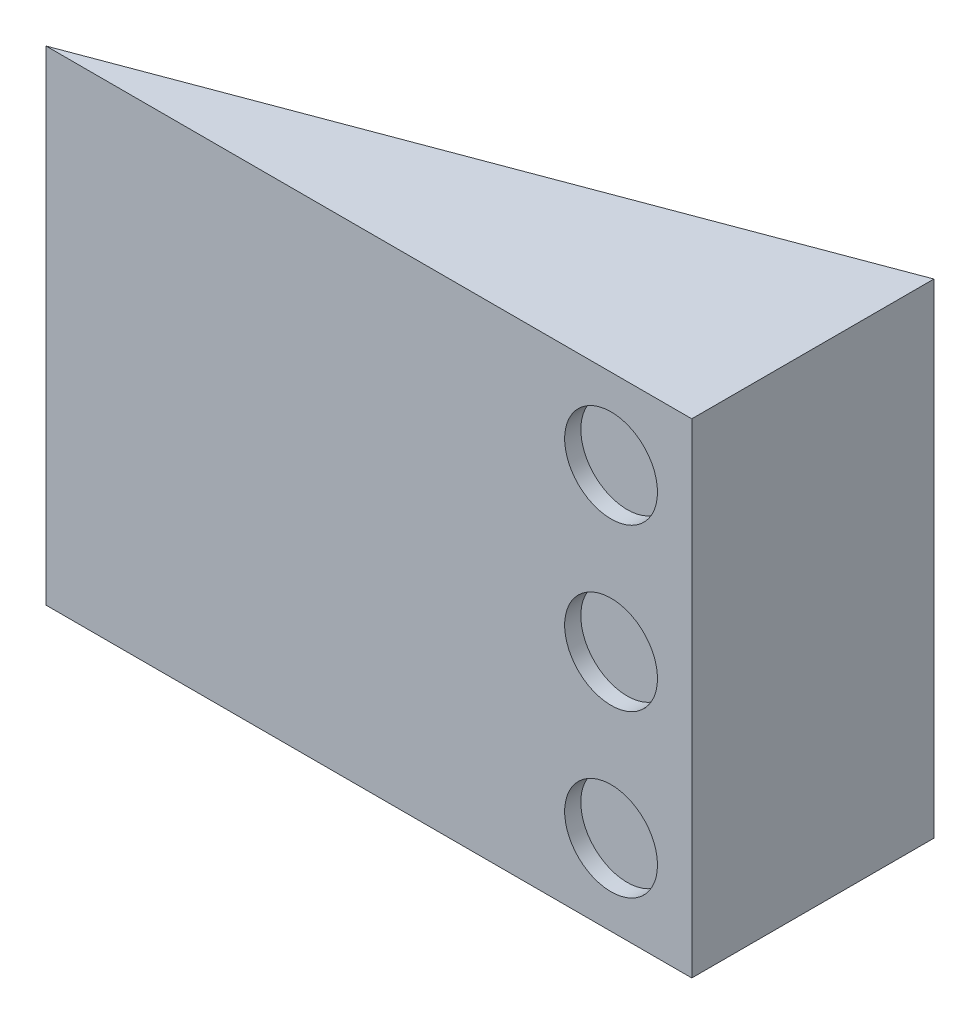
ISO-10303-21;
HEADER;
FILE_DESCRIPTION(('STEP AP214'),'2;1');
FILE_NAME('part.step','',(''),(''),'','','');
FILE_SCHEMA(('AUTOMOTIVE_DESIGN { 1 0 10303 214 1 1 1 1 }'));
ENDSEC;
DATA;
#1=APPLICATION_CONTEXT('core data for automotive mechanical design processes');
#2=APPLICATION_PROTOCOL_DEFINITION('international standard','automotive_design',2000,#1);
#3=PRODUCT_CONTEXT('',#1,'mechanical');
#4=PRODUCT('Part','Part','',(#3));
#5=PRODUCT_RELATED_PRODUCT_CATEGORY('part','',(#4));
#6=PRODUCT_DEFINITION_FORMATION('','',#4);
#7=PRODUCT_DEFINITION_CONTEXT('part definition',#1,'design');
#8=PRODUCT_DEFINITION('design','',#6,#7);
#9=PRODUCT_DEFINITION_SHAPE('','',#8);
#10=(LENGTH_UNIT() NAMED_UNIT(*) SI_UNIT(.MILLI.,.METRE.));
#11=(NAMED_UNIT(*) PLANE_ANGLE_UNIT() SI_UNIT($,.RADIAN.));
#12=(NAMED_UNIT(*) SI_UNIT($,.STERADIAN.) SOLID_ANGLE_UNIT());
#13=UNCERTAINTY_MEASURE_WITH_UNIT(LENGTH_MEASURE(1.E-05),#10,'distance_accuracy_value','');
#14=(GEOMETRIC_REPRESENTATION_CONTEXT(3) GLOBAL_UNCERTAINTY_ASSIGNED_CONTEXT((#13)) GLOBAL_UNIT_ASSIGNED_CONTEXT((#10,
#11,#12)) REPRESENTATION_CONTEXT('',''));
#15=CARTESIAN_POINT('',(0.,0.,0.));
#16=DIRECTION('',(0.,0.,1.));
#17=DIRECTION('',(1.,0.,0.));
#18=AXIS2_PLACEMENT_3D('',#15,#16,#17);
#19=CARTESIAN_POINT('',(80.,60.,0.));
#20=DIRECTION('',(0.,0.,-1.));
#21=DIRECTION('',(-1.,0.,0.));
#22=AXIS2_PLACEMENT_3D('',#19,#20,#21);
#23=PLANE('',#22);
#24=CARTESIAN_POINT('',(70.,50.,0.));
#25=DIRECTION('',(0.,0.,1.));
#26=DIRECTION('',(1.,0.,0.));
#27=AXIS2_PLACEMENT_3D('',#24,#25,#26);
#28=CIRCLE('',#27,5.74999999999999);
#29=CARTESIAN_POINT('',(75.75,50.,0.));
#30=VERTEX_POINT('',#29);
#31=EDGE_CURVE('E93',#30,#30,#28,.T.);
#32=ORIENTED_EDGE('',*,*,#31,.F.);
#33=EDGE_LOOP('',(#32));
#34=FACE_BOUND('',#33,.T.);
#35=CARTESIAN_POINT('',(70.,30.,0.));
#36=DIRECTION('',(0.,0.,1.));
#37=DIRECTION('',(1.,0.,0.));
#38=AXIS2_PLACEMENT_3D('',#35,#36,#37);
#39=CIRCLE('',#38,5.74999999999999);
#40=CARTESIAN_POINT('',(75.75,30.,0.));
#41=VERTEX_POINT('',#40);
#42=EDGE_CURVE('E123',#41,#41,#39,.T.);
#43=ORIENTED_EDGE('',*,*,#42,.F.);
#44=EDGE_LOOP('',(#43));
#45=FACE_BOUND('',#44,.T.);
#46=CARTESIAN_POINT('',(70.,10.,0.));
#47=DIRECTION('',(0.,0.,1.));
#48=DIRECTION('',(1.,0.,0.));
#49=AXIS2_PLACEMENT_3D('',#46,#47,#48);
#50=CIRCLE('',#49,5.75);
#51=CARTESIAN_POINT('',(75.75,10.,0.));
#52=VERTEX_POINT('',#51);
#53=EDGE_CURVE('E126',#52,#52,#50,.T.);
#54=ORIENTED_EDGE('',*,*,#53,.F.);
#55=EDGE_LOOP('',(#54));
#56=FACE_BOUND('',#55,.T.);
#57=DIRECTION('',(1.,0.,0.));
#58=VECTOR('',#57,1.);
#59=CARTESIAN_POINT('',(80.,0.,0.));
#60=LINE('',#59,#58);
#61=CARTESIAN_POINT('',(0.,0.,0.));
#62=VERTEX_POINT('',#61);
#63=CARTESIAN_POINT('',(80.,0.,0.));
#64=VERTEX_POINT('',#63);
#65=EDGE_CURVE('E86',#62,#64,#60,.T.);
#66=ORIENTED_EDGE('',*,*,#65,.T.);
#67=DIRECTION('',(0.,-1.,0.));
#68=VECTOR('',#67,1.);
#69=CARTESIAN_POINT('',(80.,60.,0.));
#70=LINE('',#69,#68);
#71=CARTESIAN_POINT('',(80.,60.,0.));
#72=VERTEX_POINT('',#71);
#73=EDGE_CURVE('E11',#72,#64,#70,.T.);
#74=ORIENTED_EDGE('',*,*,#73,.F.);
#75=DIRECTION('',(1.,0.,0.));
#76=VECTOR('',#75,1.);
#77=CARTESIAN_POINT('',(80.,60.,0.));
#78=LINE('',#77,#76);
#79=CARTESIAN_POINT('',(0.,60.,0.));
#80=VERTEX_POINT('',#79);
#81=EDGE_CURVE('E79',#80,#72,#78,.T.);
#82=ORIENTED_EDGE('',*,*,#81,.F.);
#83=DIRECTION('',(0.,-1.,0.));
#84=VECTOR('',#83,1.);
#85=CARTESIAN_POINT('',(0.,60.,0.));
#86=LINE('',#85,#84);
#87=EDGE_CURVE('E87',#80,#62,#86,.T.);
#88=ORIENTED_EDGE('',*,*,#87,.T.);
#89=EDGE_LOOP('',(#66,#74,#82,#88));
#90=FACE_BOUND('',#89,.T.);
#91=ADVANCED_FACE('F39',(#34,#45,#56,#90),#23,.F.);
#92=CARTESIAN_POINT('',(80.,60.,-30.));
#93=DIRECTION('',(-1.,0.,0.));
#94=DIRECTION('',(0.,0.,1.));
#95=AXIS2_PLACEMENT_3D('',#92,#93,#94);
#96=PLANE('',#95);
#97=DIRECTION('',(0.,0.,-1.));
#98=VECTOR('',#97,1.);
#99=CARTESIAN_POINT('',(80.,0.,-30.));
#100=LINE('',#99,#98);
#101=CARTESIAN_POINT('',(80.,0.,-30.));
#102=VERTEX_POINT('',#101);
#103=EDGE_CURVE('E67',#64,#102,#100,.T.);
#104=ORIENTED_EDGE('',*,*,#103,.T.);
#105=DIRECTION('',(0.,-1.,0.));
#106=VECTOR('',#105,1.);
#107=CARTESIAN_POINT('',(80.,60.,-30.));
#108=LINE('',#107,#106);
#109=CARTESIAN_POINT('',(80.,60.,-30.));
#110=VERTEX_POINT('',#109);
#111=EDGE_CURVE('E47',#110,#102,#108,.T.);
#112=ORIENTED_EDGE('',*,*,#111,.F.);
#113=DIRECTION('',(0.,0.,-1.));
#114=VECTOR('',#113,1.);
#115=CARTESIAN_POINT('',(80.,60.,-30.));
#116=LINE('',#115,#114);
#117=EDGE_CURVE('E75',#72,#110,#116,.T.);
#118=ORIENTED_EDGE('',*,*,#117,.F.);
#119=ORIENTED_EDGE('',*,*,#73,.T.);
#120=EDGE_LOOP('',(#104,#112,#118,#119));
#121=FACE_BOUND('',#120,.T.);
#122=ADVANCED_FACE('F76',(#121),#96,.F.);
#123=CARTESIAN_POINT('',(0.,60.,0.));
#124=DIRECTION('',(0.351123441588392,0.,0.936329177569045));
#125=DIRECTION('',(0.936329177569045,0.,-0.351123441588392));
#126=AXIS2_PLACEMENT_3D('',#123,#124,#125);
#127=PLANE('',#126);
#128=DIRECTION('',(-0.936329177569045,0.,0.351123441588392));
#129=VECTOR('',#128,1.);
#130=CARTESIAN_POINT('',(0.,0.,0.));
#131=LINE('',#130,#129);
#132=EDGE_CURVE('E72',#102,#62,#131,.T.);
#133=ORIENTED_EDGE('',*,*,#132,.T.);
#134=ORIENTED_EDGE('',*,*,#87,.F.);
#135=DIRECTION('',(-0.936329177569045,0.,0.351123441588392));
#136=VECTOR('',#135,1.);
#137=CARTESIAN_POINT('',(0.,60.,0.));
#138=LINE('',#137,#136);
#139=EDGE_CURVE('E55',#110,#80,#138,.T.);
#140=ORIENTED_EDGE('',*,*,#139,.F.);
#141=ORIENTED_EDGE('',*,*,#111,.T.);
#142=EDGE_LOOP('',(#133,#134,#140,#141));
#143=FACE_BOUND('',#142,.T.);
#144=ADVANCED_FACE('F98',(#143),#127,.F.);
#145=CARTESIAN_POINT('',(0.,60.,0.));
#146=DIRECTION('',(0.,1.,0.));
#147=DIRECTION('',(0.,0.,1.));
#148=AXIS2_PLACEMENT_3D('',#145,#146,#147);
#149=PLANE('',#148);
#150=ORIENTED_EDGE('',*,*,#81,.T.);
#151=ORIENTED_EDGE('',*,*,#117,.T.);
#152=ORIENTED_EDGE('',*,*,#139,.T.);
#153=EDGE_LOOP('',(#150,#151,#152));
#154=FACE_BOUND('',#153,.T.);
#155=ADVANCED_FACE('F82',(#154),#149,.T.);
#156=CARTESIAN_POINT('',(0.,0.,0.));
#157=DIRECTION('',(0.,1.,0.));
#158=DIRECTION('',(0.,0.,1.));
#159=AXIS2_PLACEMENT_3D('',#156,#157,#158);
#160=PLANE('',#159);
#161=ORIENTED_EDGE('',*,*,#65,.F.);
#162=ORIENTED_EDGE('',*,*,#132,.F.);
#163=ORIENTED_EDGE('',*,*,#103,.F.);
#164=EDGE_LOOP('',(#161,#162,#163));
#165=FACE_BOUND('',#164,.T.);
#166=ADVANCED_FACE('F99',(#165),#160,.F.);
#167=CARTESIAN_POINT('',(70.,10.,-2.));
#168=DIRECTION('',(0.,0.,1.));
#169=DIRECTION('',(1.,0.,0.));
#170=AXIS2_PLACEMENT_3D('',#167,#168,#169);
#171=CYLINDRICAL_SURFACE('',#170,5.75);
#172=CARTESIAN_POINT('',(70.,10.,-2.));
#173=DIRECTION('',(0.,0.,1.));
#174=DIRECTION('',(1.,0.,0.));
#175=AXIS2_PLACEMENT_3D('',#172,#173,#174);
#176=CIRCLE('',#175,5.75);
#177=CARTESIAN_POINT('',(75.75,10.,-2.));
#178=VERTEX_POINT('',#177);
#179=EDGE_CURVE('E129',#178,#178,#176,.T.);
#180=ORIENTED_EDGE('',*,*,#179,.F.);
#181=EDGE_LOOP('',(#180));
#182=FACE_BOUND('',#181,.T.);
#183=ORIENTED_EDGE('',*,*,#53,.T.);
#184=EDGE_LOOP('',(#183));
#185=FACE_BOUND('',#184,.T.);
#186=ADVANCED_FACE('F101',(#182,#185),#171,.F.);
#187=CARTESIAN_POINT('',(70.,10.,-2.));
#188=DIRECTION('',(0.,0.,1.));
#189=DIRECTION('',(1.,0.,0.));
#190=AXIS2_PLACEMENT_3D('',#187,#188,#189);
#191=PLANE('',#190);
#192=ORIENTED_EDGE('',*,*,#179,.T.);
#193=EDGE_LOOP('',(#192));
#194=FACE_BOUND('',#193,.T.);
#195=ADVANCED_FACE('F107',(#194),#191,.T.);
#196=CARTESIAN_POINT('',(70.,30.,-2.));
#197=DIRECTION('',(0.,0.,1.));
#198=DIRECTION('',(1.,0.,0.));
#199=AXIS2_PLACEMENT_3D('',#196,#197,#198);
#200=CYLINDRICAL_SURFACE('',#199,5.74999999999999);
#201=CARTESIAN_POINT('',(70.,30.,-2.));
#202=DIRECTION('',(0.,0.,1.));
#203=DIRECTION('',(1.,0.,0.));
#204=AXIS2_PLACEMENT_3D('',#201,#202,#203);
#205=CIRCLE('',#204,5.74999999999999);
#206=CARTESIAN_POINT('',(75.75,30.,-2.));
#207=VERTEX_POINT('',#206);
#208=EDGE_CURVE('E128',#207,#207,#205,.T.);
#209=ORIENTED_EDGE('',*,*,#208,.F.);
#210=EDGE_LOOP('',(#209));
#211=FACE_BOUND('',#210,.T.);
#212=ORIENTED_EDGE('',*,*,#42,.T.);
#213=EDGE_LOOP('',(#212));
#214=FACE_BOUND('',#213,.T.);
#215=ADVANCED_FACE('F150',(#211,#214),#200,.F.);
#216=CARTESIAN_POINT('',(70.,30.,-2.));
#217=DIRECTION('',(0.,0.,1.));
#218=DIRECTION('',(1.,0.,0.));
#219=AXIS2_PLACEMENT_3D('',#216,#217,#218);
#220=PLANE('',#219);
#221=ORIENTED_EDGE('',*,*,#208,.T.);
#222=EDGE_LOOP('',(#221));
#223=FACE_BOUND('',#222,.T.);
#224=ADVANCED_FACE('F141',(#223),#220,.T.);
#225=CARTESIAN_POINT('',(70.,50.,-2.));
#226=DIRECTION('',(0.,0.,1.));
#227=DIRECTION('',(1.,0.,0.));
#228=AXIS2_PLACEMENT_3D('',#225,#226,#227);
#229=CYLINDRICAL_SURFACE('',#228,5.74999999999999);
#230=CARTESIAN_POINT('',(70.,50.,-2.));
#231=DIRECTION('',(0.,0.,1.));
#232=DIRECTION('',(1.,0.,0.));
#233=AXIS2_PLACEMENT_3D('',#230,#231,#232);
#234=CIRCLE('',#233,5.74999999999999);
#235=CARTESIAN_POINT('',(75.75,50.,-2.));
#236=VERTEX_POINT('',#235);
#237=EDGE_CURVE('E89',#236,#236,#234,.T.);
#238=ORIENTED_EDGE('',*,*,#237,.F.);
#239=EDGE_LOOP('',(#238));
#240=FACE_BOUND('',#239,.T.);
#241=ORIENTED_EDGE('',*,*,#31,.T.);
#242=EDGE_LOOP('',(#241));
#243=FACE_BOUND('',#242,.T.);
#244=ADVANCED_FACE('F138',(#240,#243),#229,.F.);
#245=CARTESIAN_POINT('',(70.,50.,-2.));
#246=DIRECTION('',(0.,0.,1.));
#247=DIRECTION('',(1.,0.,0.));
#248=AXIS2_PLACEMENT_3D('',#245,#246,#247);
#249=PLANE('',#248);
#250=ORIENTED_EDGE('',*,*,#237,.T.);
#251=EDGE_LOOP('',(#250));
#252=FACE_BOUND('',#251,.T.);
#253=ADVANCED_FACE('F140',(#252),#249,.T.);
#254=CLOSED_SHELL('',(#91,#122,#144,#155,#166,#186,#195,#215,#224,#244,#253));
#255=MANIFOLD_SOLID_BREP('B2',#254);
#256=ADVANCED_BREP_SHAPE_REPRESENTATION('',(#18,#255),#14);
#257=SHAPE_DEFINITION_REPRESENTATION(#9,#256);
ENDSEC;
END-ISO-10303-21;
